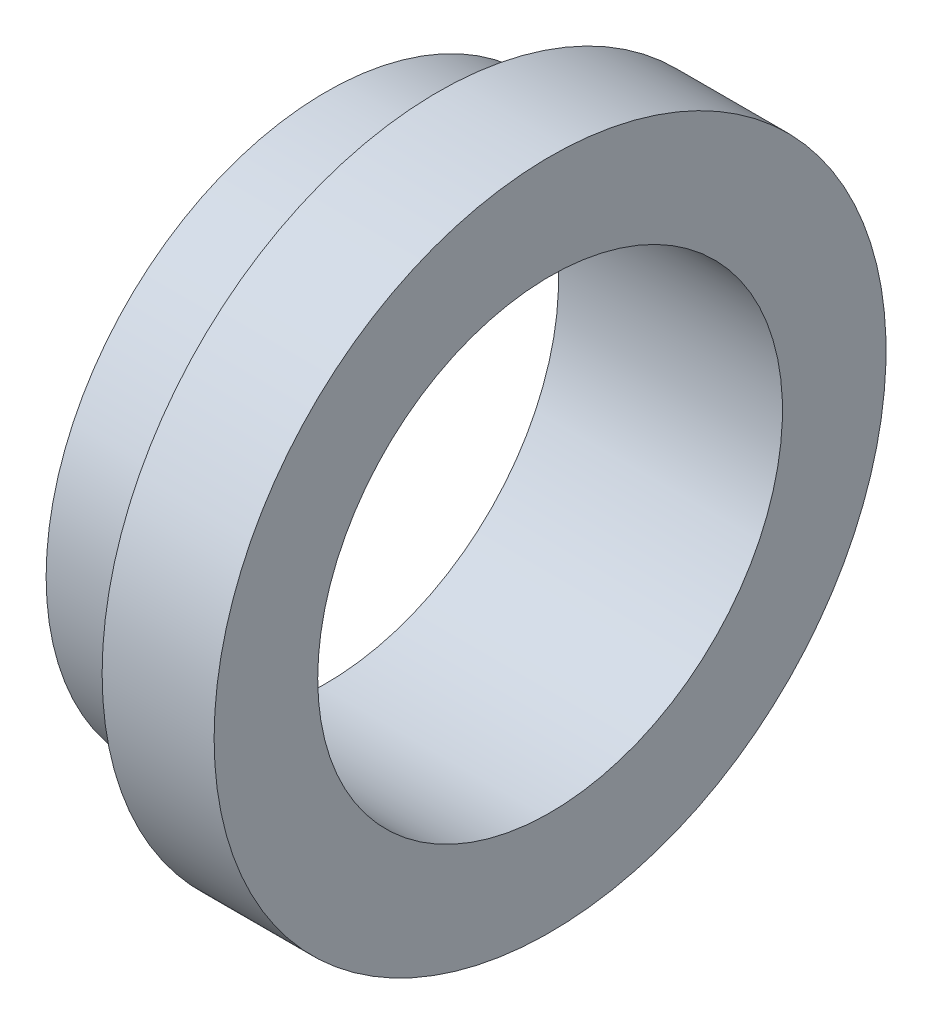
ISO-10303-21;
HEADER;
FILE_DESCRIPTION(('STEP AP214'),'2;1');
FILE_NAME('part.step','',(''),(''),'','','');
FILE_SCHEMA(('AUTOMOTIVE_DESIGN { 1 0 10303 214 1 1 1 1 }'));
ENDSEC;
DATA;
#1=APPLICATION_CONTEXT('core data for automotive mechanical design processes');
#2=APPLICATION_PROTOCOL_DEFINITION('international standard','automotive_design',2000,#1);
#3=PRODUCT_CONTEXT('',#1,'mechanical');
#4=PRODUCT('Part','Part','',(#3));
#5=PRODUCT_RELATED_PRODUCT_CATEGORY('part','',(#4));
#6=PRODUCT_DEFINITION_FORMATION('','',#4);
#7=PRODUCT_DEFINITION_CONTEXT('part definition',#1,'design');
#8=PRODUCT_DEFINITION('design','',#6,#7);
#9=PRODUCT_DEFINITION_SHAPE('','',#8);
#10=(LENGTH_UNIT() NAMED_UNIT(*) SI_UNIT(.MILLI.,.METRE.));
#11=(NAMED_UNIT(*) PLANE_ANGLE_UNIT() SI_UNIT($,.RADIAN.));
#12=(NAMED_UNIT(*) SI_UNIT($,.STERADIAN.) SOLID_ANGLE_UNIT());
#13=UNCERTAINTY_MEASURE_WITH_UNIT(LENGTH_MEASURE(1.E-05),#10,'distance_accuracy_value','');
#14=(GEOMETRIC_REPRESENTATION_CONTEXT(3) GLOBAL_UNCERTAINTY_ASSIGNED_CONTEXT((#13)) GLOBAL_UNIT_ASSIGNED_CONTEXT((#10,
#11,#12)) REPRESENTATION_CONTEXT('',''));
#15=CARTESIAN_POINT('',(0.,0.,0.));
#16=DIRECTION('',(0.,0.,1.));
#17=DIRECTION('',(1.,0.,0.));
#18=AXIS2_PLACEMENT_3D('',#15,#16,#17);
#19=CARTESIAN_POINT('',(-3.,0.,0.));
#20=DIRECTION('',(1.,0.,0.));
#21=DIRECTION('',(0.,0.,-1.));
#22=AXIS2_PLACEMENT_3D('',#19,#20,#21);
#23=PLANE('',#22);
#24=CARTESIAN_POINT('',(-3.,0.,0.));
#25=DIRECTION('',(-1.,0.,0.));
#26=DIRECTION('',(0.,0.,1.));
#27=AXIS2_PLACEMENT_3D('',#24,#25,#26);
#28=CIRCLE('',#27,4.15);
#29=CARTESIAN_POINT('',(-3.,0.,4.15));
#30=VERTEX_POINT('',#29);
#31=EDGE_CURVE('E10',#30,#30,#28,.T.);
#32=ORIENTED_EDGE('',*,*,#31,.F.);
#33=EDGE_LOOP('',(#32));
#34=FACE_BOUND('',#33,.T.);
#35=CARTESIAN_POINT('',(-3.,0.,0.));
#36=DIRECTION('',(-1.,0.,0.));
#37=DIRECTION('',(0.,0.,1.));
#38=AXIS2_PLACEMENT_3D('',#35,#36,#37);
#39=CIRCLE('',#38,5.);
#40=CARTESIAN_POINT('',(-3.,0.,5.));
#41=VERTEX_POINT('',#40);
#42=EDGE_CURVE('E54',#41,#41,#39,.T.);
#43=ORIENTED_EDGE('',*,*,#42,.T.);
#44=EDGE_LOOP('',(#43));
#45=FACE_BOUND('',#44,.T.);
#46=ADVANCED_FACE('F32',(#34,#45),#23,.F.);
#47=CARTESIAN_POINT('',(1.99772209567218,0.,0.));
#48=DIRECTION('',(-1.,0.,0.));
#49=DIRECTION('',(0.,0.,1.));
#50=AXIS2_PLACEMENT_3D('',#47,#48,#49);
#51=CYLINDRICAL_SURFACE('',#50,4.15);
#52=CARTESIAN_POINT('',(1.,0.,0.));
#53=DIRECTION('',(-1.,0.,0.));
#54=DIRECTION('',(0.,0.,1.));
#55=AXIS2_PLACEMENT_3D('',#52,#53,#54);
#56=CIRCLE('',#55,4.15);
#57=CARTESIAN_POINT('',(1.,0.,4.15));
#58=VERTEX_POINT('',#57);
#59=EDGE_CURVE('E38',#58,#58,#56,.T.);
#60=ORIENTED_EDGE('',*,*,#59,.F.);
#61=EDGE_LOOP('',(#60));
#62=FACE_BOUND('',#61,.T.);
#63=ORIENTED_EDGE('',*,*,#31,.T.);
#64=EDGE_LOOP('',(#63));
#65=FACE_BOUND('',#64,.T.);
#66=ADVANCED_FACE('F71',(#62,#65),#51,.F.);
#67=CARTESIAN_POINT('',(1.,0.,0.));
#68=DIRECTION('',(1.,0.,0.));
#69=DIRECTION('',(0.,0.,-1.));
#70=AXIS2_PLACEMENT_3D('',#67,#68,#69);
#71=PLANE('',#70);
#72=ORIENTED_EDGE('',*,*,#59,.T.);
#73=EDGE_LOOP('',(#72));
#74=FACE_BOUND('',#73,.T.);
#75=CARTESIAN_POINT('',(1.,0.,0.));
#76=DIRECTION('',(-1.,0.,0.));
#77=DIRECTION('',(0.,0.,1.));
#78=AXIS2_PLACEMENT_3D('',#75,#76,#77);
#79=CIRCLE('',#78,6.);
#80=CARTESIAN_POINT('',(1.,0.,6.));
#81=VERTEX_POINT('',#80);
#82=EDGE_CURVE('E42',#81,#81,#79,.T.);
#83=ORIENTED_EDGE('',*,*,#82,.F.);
#84=EDGE_LOOP('',(#83));
#85=FACE_BOUND('',#84,.T.);
#86=ADVANCED_FACE('F76',(#74,#85),#71,.T.);
#87=CARTESIAN_POINT('',(1.99772209567218,0.,0.));
#88=DIRECTION('',(-1.,0.,0.));
#89=DIRECTION('',(0.,0.,1.));
#90=AXIS2_PLACEMENT_3D('',#87,#88,#89);
#91=CYLINDRICAL_SURFACE('',#90,6.);
#92=ORIENTED_EDGE('',*,*,#82,.T.);
#93=EDGE_LOOP('',(#92));
#94=FACE_BOUND('',#93,.T.);
#95=CARTESIAN_POINT('',(-1.,0.,0.));
#96=DIRECTION('',(-1.,0.,0.));
#97=DIRECTION('',(0.,0.,1.));
#98=AXIS2_PLACEMENT_3D('',#95,#96,#97);
#99=CIRCLE('',#98,6.);
#100=CARTESIAN_POINT('',(-1.,0.,6.));
#101=VERTEX_POINT('',#100);
#102=EDGE_CURVE('E46',#101,#101,#99,.T.);
#103=ORIENTED_EDGE('',*,*,#102,.F.);
#104=EDGE_LOOP('',(#103));
#105=FACE_BOUND('',#104,.T.);
#106=ADVANCED_FACE('F67',(#94,#105),#91,.T.);
#107=CARTESIAN_POINT('',(-1.,0.,0.));
#108=DIRECTION('',(1.,0.,0.));
#109=DIRECTION('',(0.,0.,-1.));
#110=AXIS2_PLACEMENT_3D('',#107,#108,#109);
#111=PLANE('',#110);
#112=CARTESIAN_POINT('',(-1.,0.,0.));
#113=DIRECTION('',(-1.,0.,0.));
#114=DIRECTION('',(0.,0.,1.));
#115=AXIS2_PLACEMENT_3D('',#112,#113,#114);
#116=CIRCLE('',#115,5.);
#117=CARTESIAN_POINT('',(-1.,0.,5.));
#118=VERTEX_POINT('',#117);
#119=EDGE_CURVE('E51',#118,#118,#116,.T.);
#120=ORIENTED_EDGE('',*,*,#119,.F.);
#121=EDGE_LOOP('',(#120));
#122=FACE_BOUND('',#121,.T.);
#123=ORIENTED_EDGE('',*,*,#102,.T.);
#124=EDGE_LOOP('',(#123));
#125=FACE_BOUND('',#124,.T.);
#126=ADVANCED_FACE('F61',(#122,#125),#111,.F.);
#127=CARTESIAN_POINT('',(1.99772209567218,0.,0.));
#128=DIRECTION('',(-1.,0.,0.));
#129=DIRECTION('',(0.,0.,1.));
#130=AXIS2_PLACEMENT_3D('',#127,#128,#129);
#131=CYLINDRICAL_SURFACE('',#130,5.);
#132=ORIENTED_EDGE('',*,*,#119,.T.);
#133=EDGE_LOOP('',(#132));
#134=FACE_BOUND('',#133,.T.);
#135=ORIENTED_EDGE('',*,*,#42,.F.);
#136=EDGE_LOOP('',(#135));
#137=FACE_BOUND('',#136,.T.);
#138=ADVANCED_FACE('F59',(#134,#137),#131,.T.);
#139=CLOSED_SHELL('',(#46,#66,#86,#106,#126,#138));
#140=MANIFOLD_SOLID_BREP('B2',#139);
#141=ADVANCED_BREP_SHAPE_REPRESENTATION('',(#18,#140),#14);
#142=SHAPE_DEFINITION_REPRESENTATION(#9,#141);
ENDSEC;
END-ISO-10303-21;
